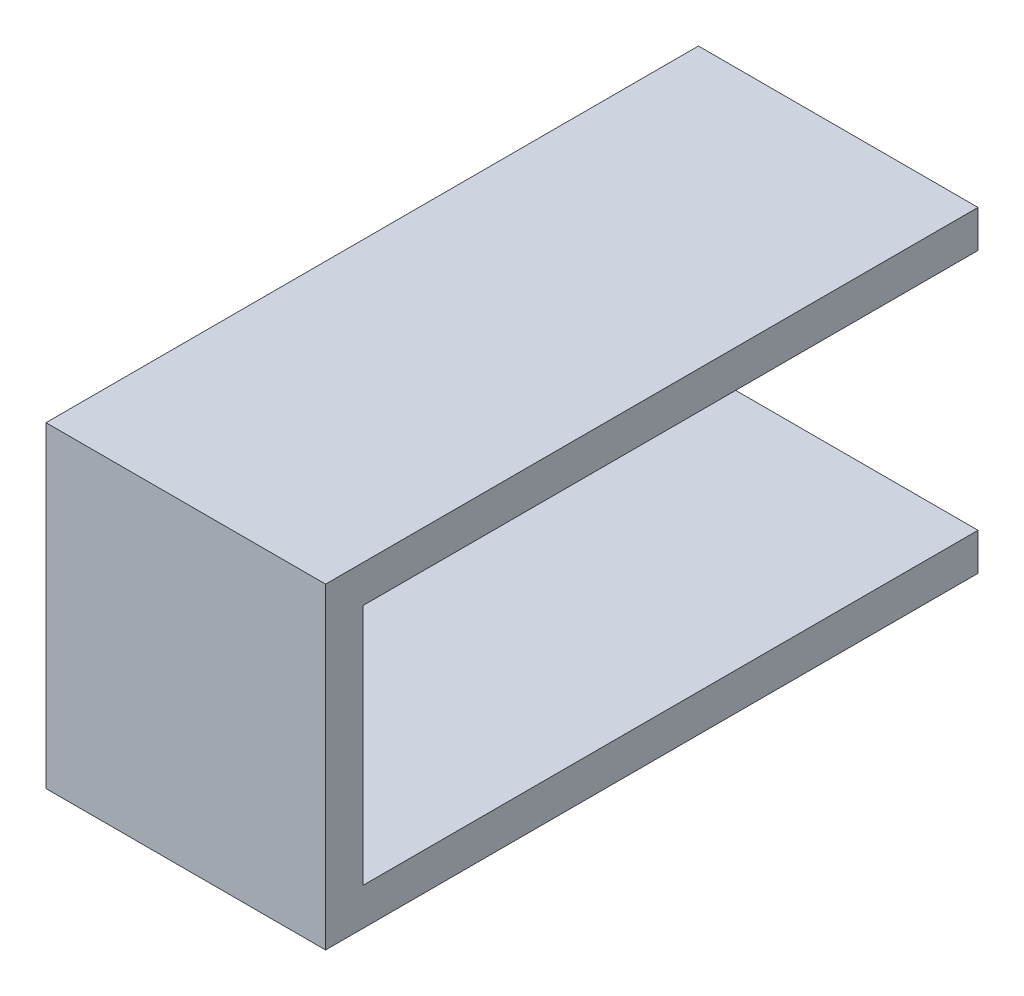
ISO-10303-21;
HEADER;
FILE_DESCRIPTION(('STEP AP214'),'2;1');
FILE_NAME('part.step','',(''),(''),'','','');
FILE_SCHEMA(('AUTOMOTIVE_DESIGN { 1 0 10303 214 1 1 1 1 }'));
ENDSEC;
DATA;
#1=APPLICATION_CONTEXT('core data for automotive mechanical design processes');
#2=APPLICATION_PROTOCOL_DEFINITION('international standard','automotive_design',2000,#1);
#3=PRODUCT_CONTEXT('',#1,'mechanical');
#4=PRODUCT('Part','Part','',(#3));
#5=PRODUCT_RELATED_PRODUCT_CATEGORY('part','',(#4));
#6=PRODUCT_DEFINITION_FORMATION('','',#4);
#7=PRODUCT_DEFINITION_CONTEXT('part definition',#1,'design');
#8=PRODUCT_DEFINITION('design','',#6,#7);
#9=PRODUCT_DEFINITION_SHAPE('','',#8);
#10=(LENGTH_UNIT() NAMED_UNIT(*) SI_UNIT(.MILLI.,.METRE.));
#11=(NAMED_UNIT(*) PLANE_ANGLE_UNIT() SI_UNIT($,.RADIAN.));
#12=(NAMED_UNIT(*) SI_UNIT($,.STERADIAN.) SOLID_ANGLE_UNIT());
#13=UNCERTAINTY_MEASURE_WITH_UNIT(LENGTH_MEASURE(1.E-05),#10,'distance_accuracy_value','');
#14=(GEOMETRIC_REPRESENTATION_CONTEXT(3) GLOBAL_UNCERTAINTY_ASSIGNED_CONTEXT((#13)) GLOBAL_UNIT_ASSIGNED_CONTEXT((#10,
#11,#12)) REPRESENTATION_CONTEXT('',''));
#15=CARTESIAN_POINT('',(0.,0.,0.));
#16=DIRECTION('',(0.,0.,1.));
#17=DIRECTION('',(1.,0.,0.));
#18=AXIS2_PLACEMENT_3D('',#15,#16,#17);
#19=CARTESIAN_POINT('',(38.1,16.51,41.91));
#20=DIRECTION('',(0.,1.,0.));
#21=DIRECTION('',(0.,0.,1.));
#22=AXIS2_PLACEMENT_3D('',#19,#20,#21);
#23=PLANE('',#22);
#24=DIRECTION('',(0.,0.,-1.));
#25=VECTOR('',#24,1.);
#26=CARTESIAN_POINT('',(0.,16.51,41.91));
#27=LINE('',#26,#25);
#28=CARTESIAN_POINT('',(0.,16.51,41.91));
#29=VERTEX_POINT('',#28);
#30=CARTESIAN_POINT('',(0.,16.51,-41.91));
#31=VERTEX_POINT('',#30);
#32=EDGE_CURVE('E146',#29,#31,#27,.T.);
#33=ORIENTED_EDGE('',*,*,#32,.T.);
#34=DIRECTION('',(-1.,0.,0.));
#35=VECTOR('',#34,1.);
#36=CARTESIAN_POINT('',(38.1,16.51,-41.91));
#37=LINE('',#36,#35);
#38=CARTESIAN_POINT('',(38.1,16.51,-41.91));
#39=VERTEX_POINT('',#38);
#40=EDGE_CURVE('E11',#39,#31,#37,.T.);
#41=ORIENTED_EDGE('',*,*,#40,.F.);
#42=DIRECTION('',(0.,0.,-1.));
#43=VECTOR('',#42,1.);
#44=CARTESIAN_POINT('',(38.1,16.51,41.91));
#45=LINE('',#44,#43);
#46=CARTESIAN_POINT('',(38.1,16.51,41.91));
#47=VERTEX_POINT('',#46);
#48=EDGE_CURVE('E168',#47,#39,#45,.T.);
#49=ORIENTED_EDGE('',*,*,#48,.F.);
#50=DIRECTION('',(-1.,0.,0.));
#51=VECTOR('',#50,1.);
#52=CARTESIAN_POINT('',(38.1,16.51,41.91));
#53=LINE('',#52,#51);
#54=EDGE_CURVE('E142',#47,#29,#53,.T.);
#55=ORIENTED_EDGE('',*,*,#54,.T.);
#56=EDGE_LOOP('',(#33,#41,#49,#55));
#57=FACE_BOUND('',#56,.T.);
#58=ADVANCED_FACE('F45',(#57),#23,.F.);
#59=CARTESIAN_POINT('',(38.1,16.51,-41.91));
#60=DIRECTION('',(0.,0.,1.));
#61=DIRECTION('',(0.,-1.,0.));
#62=AXIS2_PLACEMENT_3D('',#59,#60,#61);
#63=PLANE('',#62);
#64=DIRECTION('',(0.,1.,0.));
#65=VECTOR('',#64,1.);
#66=CARTESIAN_POINT('',(0.,16.51,-41.91));
#67=LINE('',#66,#65);
#68=CARTESIAN_POINT('',(0.,21.59,-41.91));
#69=VERTEX_POINT('',#68);
#70=EDGE_CURVE('E150',#31,#69,#67,.T.);
#71=ORIENTED_EDGE('',*,*,#70,.T.);
#72=DIRECTION('',(-1.,0.,0.));
#73=VECTOR('',#72,1.);
#74=CARTESIAN_POINT('',(38.1,21.59,-41.91));
#75=LINE('',#74,#73);
#76=CARTESIAN_POINT('',(38.1,21.59,-41.91));
#77=VERTEX_POINT('',#76);
#78=EDGE_CURVE('E54',#77,#69,#75,.T.);
#79=ORIENTED_EDGE('',*,*,#78,.F.);
#80=DIRECTION('',(0.,1.,0.));
#81=VECTOR('',#80,1.);
#82=CARTESIAN_POINT('',(38.1,16.51,-41.91));
#83=LINE('',#82,#81);
#84=EDGE_CURVE('E105',#39,#77,#83,.T.);
#85=ORIENTED_EDGE('',*,*,#84,.F.);
#86=ORIENTED_EDGE('',*,*,#40,.T.);
#87=EDGE_LOOP('',(#71,#79,#85,#86));
#88=FACE_BOUND('',#87,.T.);
#89=ADVANCED_FACE('F214',(#88),#63,.F.);
#90=CARTESIAN_POINT('',(38.1,21.59,-41.91));
#91=DIRECTION('',(0.,-1.,0.));
#92=DIRECTION('',(0.,0.,-1.));
#93=AXIS2_PLACEMENT_3D('',#90,#91,#92);
#94=PLANE('',#93);
#95=DIRECTION('',(0.,0.,1.));
#96=VECTOR('',#95,1.);
#97=CARTESIAN_POINT('',(0.,21.59,-41.91));
#98=LINE('',#97,#96);
#99=CARTESIAN_POINT('',(0.,21.59,46.99));
#100=VERTEX_POINT('',#99);
#101=EDGE_CURVE('E153',#69,#100,#98,.T.);
#102=ORIENTED_EDGE('',*,*,#101,.T.);
#103=DIRECTION('',(-1.,0.,0.));
#104=VECTOR('',#103,1.);
#105=CARTESIAN_POINT('',(38.1,21.59,46.99));
#106=LINE('',#105,#104);
#107=CARTESIAN_POINT('',(38.1,21.59,46.99));
#108=VERTEX_POINT('',#107);
#109=EDGE_CURVE('E179',#108,#100,#106,.T.);
#110=ORIENTED_EDGE('',*,*,#109,.F.);
#111=DIRECTION('',(0.,0.,1.));
#112=VECTOR('',#111,1.);
#113=CARTESIAN_POINT('',(38.1,21.59,-41.91));
#114=LINE('',#113,#112);
#115=EDGE_CURVE('E189',#77,#108,#114,.T.);
#116=ORIENTED_EDGE('',*,*,#115,.F.);
#117=ORIENTED_EDGE('',*,*,#78,.T.);
#118=EDGE_LOOP('',(#102,#110,#116,#117));
#119=FACE_BOUND('',#118,.T.);
#120=ADVANCED_FACE('F187',(#119),#94,.F.);
#121=CARTESIAN_POINT('',(38.1,21.59,46.99));
#122=DIRECTION('',(0.,0.,-1.));
#123=DIRECTION('',(0.,1.,0.));
#124=AXIS2_PLACEMENT_3D('',#121,#122,#123);
#125=PLANE('',#124);
#126=DIRECTION('',(0.,-1.,0.));
#127=VECTOR('',#126,1.);
#128=CARTESIAN_POINT('',(0.,21.59,46.99));
#129=LINE('',#128,#127);
#130=CARTESIAN_POINT('',(0.,-21.59,46.99));
#131=VERTEX_POINT('',#130);
#132=EDGE_CURVE('E156',#100,#131,#129,.T.);
#133=ORIENTED_EDGE('',*,*,#132,.T.);
#134=DIRECTION('',(-1.,0.,0.));
#135=VECTOR('',#134,1.);
#136=CARTESIAN_POINT('',(38.1,-21.59,46.99));
#137=LINE('',#136,#135);
#138=CARTESIAN_POINT('',(38.1,-21.59,46.99));
#139=VERTEX_POINT('',#138);
#140=EDGE_CURVE('E175',#139,#131,#137,.T.);
#141=ORIENTED_EDGE('',*,*,#140,.F.);
#142=DIRECTION('',(0.,-1.,0.));
#143=VECTOR('',#142,1.);
#144=CARTESIAN_POINT('',(38.1,21.59,46.99));
#145=LINE('',#144,#143);
#146=EDGE_CURVE('E202',#108,#139,#145,.T.);
#147=ORIENTED_EDGE('',*,*,#146,.F.);
#148=ORIENTED_EDGE('',*,*,#109,.T.);
#149=EDGE_LOOP('',(#133,#141,#147,#148));
#150=FACE_BOUND('',#149,.T.);
#151=ADVANCED_FACE('F197',(#150),#125,.F.);
#152=CARTESIAN_POINT('',(38.1,-21.59,46.99));
#153=DIRECTION('',(0.,1.,0.));
#154=DIRECTION('',(0.,0.,1.));
#155=AXIS2_PLACEMENT_3D('',#152,#153,#154);
#156=PLANE('',#155);
#157=DIRECTION('',(0.,0.,-1.));
#158=VECTOR('',#157,1.);
#159=CARTESIAN_POINT('',(0.,-21.59,46.99));
#160=LINE('',#159,#158);
#161=CARTESIAN_POINT('',(0.,-21.59,-41.91));
#162=VERTEX_POINT('',#161);
#163=EDGE_CURVE('E159',#131,#162,#160,.T.);
#164=ORIENTED_EDGE('',*,*,#163,.T.);
#165=DIRECTION('',(-1.,0.,0.));
#166=VECTOR('',#165,1.);
#167=CARTESIAN_POINT('',(38.1,-21.59,-41.91));
#168=LINE('',#167,#166);
#169=CARTESIAN_POINT('',(38.1,-21.59,-41.91));
#170=VERTEX_POINT('',#169);
#171=EDGE_CURVE('E135',#170,#162,#168,.T.);
#172=ORIENTED_EDGE('',*,*,#171,.F.);
#173=DIRECTION('',(0.,0.,-1.));
#174=VECTOR('',#173,1.);
#175=CARTESIAN_POINT('',(38.1,-21.59,46.99));
#176=LINE('',#175,#174);
#177=EDGE_CURVE('E124',#139,#170,#176,.T.);
#178=ORIENTED_EDGE('',*,*,#177,.F.);
#179=ORIENTED_EDGE('',*,*,#140,.T.);
#180=EDGE_LOOP('',(#164,#172,#178,#179));
#181=FACE_BOUND('',#180,.T.);
#182=ADVANCED_FACE('F200',(#181),#156,.F.);
#183=CARTESIAN_POINT('',(38.1,-21.59,-41.91));
#184=DIRECTION('',(0.,0.,1.));
#185=DIRECTION('',(0.,-1.,0.));
#186=AXIS2_PLACEMENT_3D('',#183,#184,#185);
#187=PLANE('',#186);
#188=DIRECTION('',(0.,1.,0.));
#189=VECTOR('',#188,1.);
#190=CARTESIAN_POINT('',(0.,-21.59,-41.91));
#191=LINE('',#190,#189);
#192=CARTESIAN_POINT('',(0.,-16.51,-41.91));
#193=VERTEX_POINT('',#192);
#194=EDGE_CURVE('E133',#162,#193,#191,.T.);
#195=ORIENTED_EDGE('',*,*,#194,.T.);
#196=DIRECTION('',(-1.,0.,0.));
#197=VECTOR('',#196,1.);
#198=CARTESIAN_POINT('',(38.1,-16.51,-41.91));
#199=LINE('',#198,#197);
#200=CARTESIAN_POINT('',(38.1,-16.51,-41.91));
#201=VERTEX_POINT('',#200);
#202=EDGE_CURVE('E130',#201,#193,#199,.T.);
#203=ORIENTED_EDGE('',*,*,#202,.F.);
#204=DIRECTION('',(0.,1.,0.));
#205=VECTOR('',#204,1.);
#206=CARTESIAN_POINT('',(38.1,-21.59,-41.91));
#207=LINE('',#206,#205);
#208=EDGE_CURVE('E118',#170,#201,#207,.T.);
#209=ORIENTED_EDGE('',*,*,#208,.F.);
#210=ORIENTED_EDGE('',*,*,#171,.T.);
#211=EDGE_LOOP('',(#195,#203,#209,#210));
#212=FACE_BOUND('',#211,.T.);
#213=ADVANCED_FACE('F131',(#212),#187,.F.);
#214=CARTESIAN_POINT('',(38.1,-16.51,-41.91));
#215=DIRECTION('',(0.,-1.,0.));
#216=DIRECTION('',(0.,0.,-1.));
#217=AXIS2_PLACEMENT_3D('',#214,#215,#216);
#218=PLANE('',#217);
#219=DIRECTION('',(0.,0.,1.));
#220=VECTOR('',#219,1.);
#221=CARTESIAN_POINT('',(0.,-16.51,-41.91));
#222=LINE('',#221,#220);
#223=CARTESIAN_POINT('',(0.,-16.51,41.91));
#224=VERTEX_POINT('',#223);
#225=EDGE_CURVE('E91',#193,#224,#222,.T.);
#226=ORIENTED_EDGE('',*,*,#225,.T.);
#227=DIRECTION('',(-1.,0.,0.));
#228=VECTOR('',#227,1.);
#229=CARTESIAN_POINT('',(38.1,-16.51,41.91));
#230=LINE('',#229,#228);
#231=CARTESIAN_POINT('',(38.1,-16.51,41.91));
#232=VERTEX_POINT('',#231);
#233=EDGE_CURVE('E136',#232,#224,#230,.T.);
#234=ORIENTED_EDGE('',*,*,#233,.F.);
#235=DIRECTION('',(0.,0.,1.));
#236=VECTOR('',#235,1.);
#237=CARTESIAN_POINT('',(38.1,-16.51,-41.91));
#238=LINE('',#237,#236);
#239=EDGE_CURVE('E122',#201,#232,#238,.T.);
#240=ORIENTED_EDGE('',*,*,#239,.F.);
#241=ORIENTED_EDGE('',*,*,#202,.T.);
#242=EDGE_LOOP('',(#226,#234,#240,#241));
#243=FACE_BOUND('',#242,.T.);
#244=ADVANCED_FACE('F138',(#243),#218,.F.);
#245=CARTESIAN_POINT('',(38.1,-16.51,41.91));
#246=DIRECTION('',(0.,0.,1.));
#247=DIRECTION('',(1.,0.,0.));
#248=AXIS2_PLACEMENT_3D('',#245,#246,#247);
#249=PLANE('',#248);
#250=DIRECTION('',(0.,1.,0.));
#251=VECTOR('',#250,1.);
#252=CARTESIAN_POINT('',(0.,-16.51,41.91));
#253=LINE('',#252,#251);
#254=EDGE_CURVE('E97',#224,#29,#253,.T.);
#255=ORIENTED_EDGE('',*,*,#254,.T.);
#256=ORIENTED_EDGE('',*,*,#54,.F.);
#257=DIRECTION('',(0.,1.,0.));
#258=VECTOR('',#257,1.);
#259=CARTESIAN_POINT('',(38.1,-16.51,41.91));
#260=LINE('',#259,#258);
#261=EDGE_CURVE('E62',#232,#47,#260,.T.);
#262=ORIENTED_EDGE('',*,*,#261,.F.);
#263=ORIENTED_EDGE('',*,*,#233,.T.);
#264=EDGE_LOOP('',(#255,#256,#262,#263));
#265=FACE_BOUND('',#264,.T.);
#266=ADVANCED_FACE('F230',(#265),#249,.F.);
#267=CARTESIAN_POINT('',(38.1,0.,0.));
#268=DIRECTION('',(1.,0.,0.));
#269=DIRECTION('',(0.,0.,-1.));
#270=AXIS2_PLACEMENT_3D('',#267,#268,#269);
#271=PLANE('',#270);
#272=ORIENTED_EDGE('',*,*,#48,.T.);
#273=ORIENTED_EDGE('',*,*,#84,.T.);
#274=ORIENTED_EDGE('',*,*,#115,.T.);
#275=ORIENTED_EDGE('',*,*,#146,.T.);
#276=ORIENTED_EDGE('',*,*,#177,.T.);
#277=ORIENTED_EDGE('',*,*,#208,.T.);
#278=ORIENTED_EDGE('',*,*,#239,.T.);
#279=ORIENTED_EDGE('',*,*,#261,.T.);
#280=EDGE_LOOP('',(#272,#273,#274,#275,#276,#277,#278,#279));
#281=FACE_BOUND('',#280,.T.);
#282=ADVANCED_FACE('F120',(#281),#271,.T.);
#283=CARTESIAN_POINT('',(0.,0.,0.));
#284=DIRECTION('',(1.,0.,0.));
#285=DIRECTION('',(0.,0.,-1.));
#286=AXIS2_PLACEMENT_3D('',#283,#284,#285);
#287=PLANE('',#286);
#288=ORIENTED_EDGE('',*,*,#32,.F.);
#289=ORIENTED_EDGE('',*,*,#254,.F.);
#290=ORIENTED_EDGE('',*,*,#225,.F.);
#291=ORIENTED_EDGE('',*,*,#194,.F.);
#292=ORIENTED_EDGE('',*,*,#163,.F.);
#293=ORIENTED_EDGE('',*,*,#132,.F.);
#294=ORIENTED_EDGE('',*,*,#101,.F.);
#295=ORIENTED_EDGE('',*,*,#70,.F.);
#296=EDGE_LOOP('',(#288,#289,#290,#291,#292,#293,#294,#295));
#297=FACE_BOUND('',#296,.T.);
#298=ADVANCED_FACE('F193',(#297),#287,.F.);
#299=CLOSED_SHELL('',(#58,#89,#120,#151,#182,#213,#244,#266,#282,#298));
#300=MANIFOLD_SOLID_BREP('B2',#299);
#301=ADVANCED_BREP_SHAPE_REPRESENTATION('',(#18,#300),#14);
#302=SHAPE_DEFINITION_REPRESENTATION(#9,#301);
ENDSEC;
END-ISO-10303-21;
